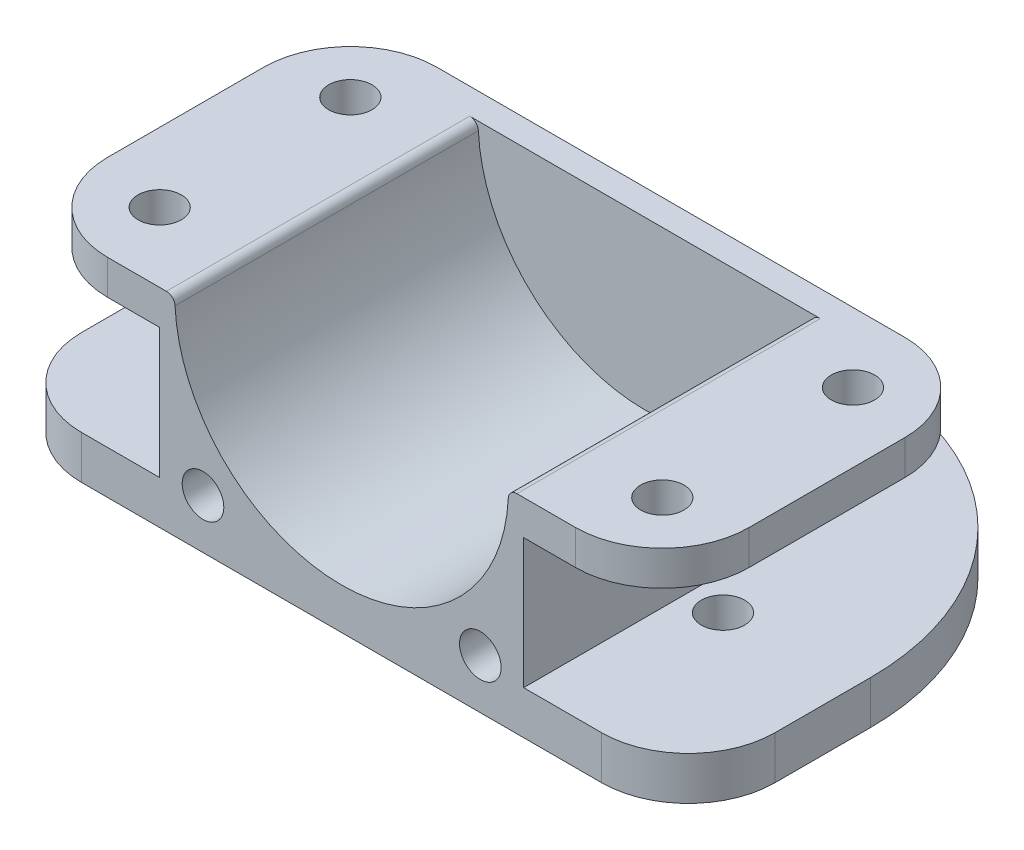
ISO-10303-21;
HEADER;
FILE_DESCRIPTION(('STEP AP214'),'2;1');
FILE_NAME('part.step','',(''),(''),'','','');
FILE_SCHEMA(('AUTOMOTIVE_DESIGN { 1 0 10303 214 1 1 1 1 }'));
ENDSEC;
DATA;
#1=APPLICATION_CONTEXT('core data for automotive mechanical design processes');
#2=APPLICATION_PROTOCOL_DEFINITION('international standard','automotive_design',2000,#1);
#3=PRODUCT_CONTEXT('',#1,'mechanical');
#4=PRODUCT('Part','Part','',(#3));
#5=PRODUCT_RELATED_PRODUCT_CATEGORY('part','',(#4));
#6=PRODUCT_DEFINITION_FORMATION('','',#4);
#7=PRODUCT_DEFINITION_CONTEXT('part definition',#1,'design');
#8=PRODUCT_DEFINITION('design','',#6,#7);
#9=PRODUCT_DEFINITION_SHAPE('','',#8);
#10=(LENGTH_UNIT() NAMED_UNIT(*) SI_UNIT(.MILLI.,.METRE.));
#11=(NAMED_UNIT(*) PLANE_ANGLE_UNIT() SI_UNIT($,.RADIAN.));
#12=(NAMED_UNIT(*) SI_UNIT($,.STERADIAN.) SOLID_ANGLE_UNIT());
#13=UNCERTAINTY_MEASURE_WITH_UNIT(LENGTH_MEASURE(1.E-05),#10,'distance_accuracy_value','');
#14=(GEOMETRIC_REPRESENTATION_CONTEXT(3) GLOBAL_UNCERTAINTY_ASSIGNED_CONTEXT((#13)) GLOBAL_UNIT_ASSIGNED_CONTEXT((#10,
#11,#12)) REPRESENTATION_CONTEXT('',''));
#15=CARTESIAN_POINT('',(0.,0.,0.));
#16=DIRECTION('',(0.,0.,1.));
#17=DIRECTION('',(1.,0.,0.));
#18=AXIS2_PLACEMENT_3D('',#15,#16,#17);
#19=CARTESIAN_POINT('',(-21.,-24.,-35.));
#20=DIRECTION('',(-1.,0.,0.));
#21=DIRECTION('',(0.,0.,1.));
#22=AXIS2_PLACEMENT_3D('',#19,#20,#21);
#23=PLANE('',#22);
#24=DIRECTION('',(0.,-1.,0.));
#25=VECTOR('',#24,1.);
#26=CARTESIAN_POINT('',(-21.,-24.,0.));
#27=LINE('',#26,#25);
#28=CARTESIAN_POINT('',(-21.,-4.,0.));
#29=VERTEX_POINT('',#28);
#30=CARTESIAN_POINT('',(-21.,-19.,0.));
#31=VERTEX_POINT('',#30);
#32=EDGE_CURVE('E228',#29,#31,#27,.T.);
#33=ORIENTED_EDGE('',*,*,#32,.F.);
#34=DIRECTION('',(0.,0.,1.));
#35=VECTOR('',#34,1.);
#36=CARTESIAN_POINT('',(-21.,-4.,0.));
#37=LINE('',#36,#35);
#38=CARTESIAN_POINT('',(-21.,-4.00000000000001,-38.));
#39=VERTEX_POINT('',#38);
#40=EDGE_CURVE('E214',#39,#29,#37,.T.);
#41=ORIENTED_EDGE('',*,*,#40,.F.);
#42=DIRECTION('',(0.,1.,0.));
#43=VECTOR('',#42,1.);
#44=CARTESIAN_POINT('',(-21.,-19.,-38.));
#45=LINE('',#44,#43);
#46=CARTESIAN_POINT('',(-21.,-19.,-38.));
#47=VERTEX_POINT('',#46);
#48=EDGE_CURVE('E226',#47,#39,#45,.T.);
#49=ORIENTED_EDGE('',*,*,#48,.F.);
#50=DIRECTION('',(0.,0.,1.));
#51=VECTOR('',#50,1.);
#52=CARTESIAN_POINT('',(-21.,-19.,-54.6468827043885));
#53=LINE('',#52,#51);
#54=EDGE_CURVE('E286',#47,#31,#53,.T.);
#55=ORIENTED_EDGE('',*,*,#54,.T.);
#56=EDGE_LOOP('',(#33,#41,#49,#55));
#57=FACE_BOUND('',#56,.T.);
#58=ADVANCED_FACE('F45',(#57),#23,.T.);
#59=CARTESIAN_POINT('',(0.,0.,-38.));
#60=DIRECTION('',(0.,0.,-1.));
#61=DIRECTION('',(-1.,0.,0.));
#62=AXIS2_PLACEMENT_3D('',#59,#60,#61);
#63=PLANE('',#62);
#64=DIRECTION('',(1.,0.,0.));
#65=VECTOR('',#64,1.);
#66=CARTESIAN_POINT('',(-21.,0.,-38.));
#67=LINE('',#66,#65);
#68=CARTESIAN_POINT('',(-27.,0.,-38.));
#69=VERTEX_POINT('',#68);
#70=CARTESIAN_POINT('',(27.,0.,-38.));
#71=VERTEX_POINT('',#70);
#72=EDGE_CURVE('E452',#69,#71,#67,.T.);
#73=ORIENTED_EDGE('',*,*,#72,.T.);
#74=DIRECTION('',(0.,-1.,0.));
#75=VECTOR('',#74,1.);
#76=CARTESIAN_POINT('',(27.,-4.00000000000001,-38.));
#77=LINE('',#76,#75);
#78=CARTESIAN_POINT('',(27.,-4.00000000000001,-38.));
#79=VERTEX_POINT('',#78);
#80=EDGE_CURVE('E431',#71,#79,#77,.T.);
#81=ORIENTED_EDGE('',*,*,#80,.T.);
#82=DIRECTION('',(-1.,0.,0.));
#83=VECTOR('',#82,1.);
#84=CARTESIAN_POINT('',(37.,-4.00000000000001,-38.));
#85=LINE('',#84,#83);
#86=CARTESIAN_POINT('',(21.,-4.,-38.));
#87=VERTEX_POINT('',#86);
#88=EDGE_CURVE('E468',#79,#87,#85,.T.);
#89=ORIENTED_EDGE('',*,*,#88,.T.);
#90=DIRECTION('',(0.,-1.,0.));
#91=VECTOR('',#90,1.);
#92=CARTESIAN_POINT('',(21.,24.,-38.));
#93=LINE('',#92,#91);
#94=CARTESIAN_POINT('',(21.,-19.,-38.));
#95=VERTEX_POINT('',#94);
#96=EDGE_CURVE('E240',#87,#95,#93,.T.);
#97=ORIENTED_EDGE('',*,*,#96,.T.);
#98=DIRECTION('',(-1.,0.,0.));
#99=VECTOR('',#98,1.);
#100=CARTESIAN_POINT('',(-40.,-19.,-38.));
#101=LINE('',#100,#99);
#102=EDGE_CURVE('E237',#95,#47,#101,.T.);
#103=ORIENTED_EDGE('',*,*,#102,.T.);
#104=ORIENTED_EDGE('',*,*,#48,.T.);
#105=DIRECTION('',(1.,0.,0.));
#106=VECTOR('',#105,1.);
#107=CARTESIAN_POINT('',(-37.,-4.00000000000001,-38.));
#108=LINE('',#107,#106);
#109=CARTESIAN_POINT('',(-27.,-4.00000000000001,-38.));
#110=VERTEX_POINT('',#109);
#111=EDGE_CURVE('E209',#110,#39,#108,.T.);
#112=ORIENTED_EDGE('',*,*,#111,.F.);
#113=DIRECTION('',(0.,-1.,0.));
#114=VECTOR('',#113,1.);
#115=CARTESIAN_POINT('',(-27.,0.,-38.));
#116=LINE('',#115,#114);
#117=EDGE_CURVE('E419',#110,#69,#116,.F.);
#118=ORIENTED_EDGE('',*,*,#117,.T.);
#119=EDGE_LOOP('',(#73,#81,#89,#97,#103,#104,#112,#118));
#120=FACE_BOUND('',#119,.T.);
#121=ADVANCED_FACE('F235',(#120),#63,.T.);
#122=CARTESIAN_POINT('',(21.,-24.,-35.));
#123=DIRECTION('',(1.,0.,0.));
#124=DIRECTION('',(0.,0.,-1.));
#125=AXIS2_PLACEMENT_3D('',#122,#123,#124);
#126=PLANE('',#125);
#127=DIRECTION('',(0.,0.,1.));
#128=VECTOR('',#127,1.);
#129=CARTESIAN_POINT('',(21.,-4.,0.));
#130=LINE('',#129,#128);
#131=CARTESIAN_POINT('',(21.,-4.00000000000001,0.));
#132=VERTEX_POINT('',#131);
#133=EDGE_CURVE('E471',#87,#132,#130,.T.);
#134=ORIENTED_EDGE('',*,*,#133,.T.);
#135=DIRECTION('',(0.,1.,0.));
#136=VECTOR('',#135,1.);
#137=CARTESIAN_POINT('',(21.,-24.,0.));
#138=LINE('',#137,#136);
#139=CARTESIAN_POINT('',(21.,-19.,0.));
#140=VERTEX_POINT('',#139);
#141=EDGE_CURVE('E313',#140,#132,#138,.T.);
#142=ORIENTED_EDGE('',*,*,#141,.F.);
#143=DIRECTION('',(0.,0.,1.));
#144=VECTOR('',#143,1.);
#145=CARTESIAN_POINT('',(21.,-19.,-54.6468827043885));
#146=LINE('',#145,#144);
#147=EDGE_CURVE('E255',#95,#140,#146,.T.);
#148=ORIENTED_EDGE('',*,*,#147,.F.);
#149=ORIENTED_EDGE('',*,*,#96,.F.);
#150=EDGE_LOOP('',(#134,#142,#148,#149));
#151=FACE_BOUND('',#150,.T.);
#152=ADVANCED_FACE('F591',(#151),#126,.T.);
#153=CARTESIAN_POINT('',(-21.,-24.,-35.));
#154=DIRECTION('',(0.,-1.,0.));
#155=DIRECTION('',(0.,0.,-1.));
#156=AXIS2_PLACEMENT_3D('',#153,#154,#155);
#157=PLANE('',#156);
#158=CARTESIAN_POINT('',(-15.,-24.,-43.));
#159=DIRECTION('',(0.,-1.,0.));
#160=DIRECTION('',(0.,0.,-1.));
#161=AXIS2_PLACEMENT_3D('',#158,#159,#160);
#162=CIRCLE('',#161,2.5);
#163=CARTESIAN_POINT('',(-15.,-24.,-45.5));
#164=VERTEX_POINT('',#163);
#165=EDGE_CURVE('E517',#164,#164,#162,.F.);
#166=ORIENTED_EDGE('',*,*,#165,.T.);
#167=EDGE_LOOP('',(#166));
#168=FACE_BOUND('',#167,.T.);
#169=CARTESIAN_POINT('',(15.,-24.,-43.));
#170=DIRECTION('',(0.,-1.,0.));
#171=DIRECTION('',(0.,0.,-1.));
#172=AXIS2_PLACEMENT_3D('',#169,#170,#171);
#173=CIRCLE('',#172,2.5);
#174=CARTESIAN_POINT('',(15.,-24.,-45.5));
#175=VERTEX_POINT('',#174);
#176=EDGE_CURVE('E521',#175,#175,#173,.F.);
#177=ORIENTED_EDGE('',*,*,#176,.T.);
#178=EDGE_LOOP('',(#177));
#179=FACE_BOUND('',#178,.T.);
#180=CARTESIAN_POINT('',(-25.,-24.,-19.));
#181=DIRECTION('',(0.,-1.,0.));
#182=DIRECTION('',(0.,0.,-1.));
#183=AXIS2_PLACEMENT_3D('',#180,#181,#182);
#184=CIRCLE('',#183,2.5);
#185=CARTESIAN_POINT('',(-25.,-24.,-21.5));
#186=VERTEX_POINT('',#185);
#187=EDGE_CURVE('E256',#186,#186,#184,.F.);
#188=ORIENTED_EDGE('',*,*,#187,.T.);
#189=EDGE_LOOP('',(#188));
#190=FACE_BOUND('',#189,.T.);
#191=CARTESIAN_POINT('',(25.,-24.,-19.));
#192=DIRECTION('',(0.,-1.,0.));
#193=DIRECTION('',(0.,0.,-1.));
#194=AXIS2_PLACEMENT_3D('',#191,#192,#193);
#195=CIRCLE('',#194,2.5);
#196=CARTESIAN_POINT('',(25.,-24.,-21.5));
#197=VERTEX_POINT('',#196);
#198=EDGE_CURVE('E245',#197,#197,#195,.F.);
#199=ORIENTED_EDGE('',*,*,#198,.T.);
#200=EDGE_LOOP('',(#199));
#201=FACE_BOUND('',#200,.T.);
#202=DIRECTION('',(1.,0.,0.));
#203=VECTOR('',#202,1.);
#204=CARTESIAN_POINT('',(-21.,-24.,0.));
#205=LINE('',#204,#203);
#206=CARTESIAN_POINT('',(-30.,-24.,0.));
#207=VERTEX_POINT('',#206);
#208=CARTESIAN_POINT('',(30.,-24.,0.));
#209=VERTEX_POINT('',#208);
#210=EDGE_CURVE('E322',#207,#209,#205,.T.);
#211=ORIENTED_EDGE('',*,*,#210,.F.);
#212=CARTESIAN_POINT('',(-30.,-24.,-10.));
#213=DIRECTION('',(0.,-1.,0.));
#214=DIRECTION('',(0.,0.,-1.));
#215=AXIS2_PLACEMENT_3D('',#212,#213,#214);
#216=CIRCLE('',#215,10.);
#217=CARTESIAN_POINT('',(-40.,-24.,-10.));
#218=VERTEX_POINT('',#217);
#219=EDGE_CURVE('E391',#207,#218,#216,.T.);
#220=ORIENTED_EDGE('',*,*,#219,.T.);
#221=DIRECTION('',(0.,0.,1.));
#222=VECTOR('',#221,1.);
#223=CARTESIAN_POINT('',(-40.,-24.,-54.6468827043885));
#224=LINE('',#223,#222);
#225=CARTESIAN_POINT('',(-40.,-24.,-21.));
#226=VERTEX_POINT('',#225);
#227=EDGE_CURVE('E282',#226,#218,#224,.T.);
#228=ORIENTED_EDGE('',*,*,#227,.F.);
#229=CARTESIAN_POINT('',(-10.,-24.,-21.));
#230=DIRECTION('',(0.,-1.,0.));
#231=DIRECTION('',(0.,0.,-1.));
#232=AXIS2_PLACEMENT_3D('',#229,#230,#231);
#233=CIRCLE('',#232,30.);
#234=CARTESIAN_POINT('',(-10.,-24.,-51.));
#235=VERTEX_POINT('',#234);
#236=EDGE_CURVE('E361',#226,#235,#233,.T.);
#237=ORIENTED_EDGE('',*,*,#236,.T.);
#238=DIRECTION('',(1.,0.,0.));
#239=VECTOR('',#238,1.);
#240=CARTESIAN_POINT('',(-40.,-24.,-51.));
#241=LINE('',#240,#239);
#242=CARTESIAN_POINT('',(9.99999999999999,-24.,-51.));
#243=VERTEX_POINT('',#242);
#244=EDGE_CURVE('E516',#235,#243,#241,.T.);
#245=ORIENTED_EDGE('',*,*,#244,.T.);
#246=CARTESIAN_POINT('',(9.99999999999999,-24.,-21.));
#247=DIRECTION('',(0.,-1.,0.));
#248=DIRECTION('',(0.,0.,-1.));
#249=AXIS2_PLACEMENT_3D('',#246,#247,#248);
#250=CIRCLE('',#249,30.);
#251=CARTESIAN_POINT('',(40.,-24.,-21.));
#252=VERTEX_POINT('',#251);
#253=EDGE_CURVE('E358',#243,#252,#250,.T.);
#254=ORIENTED_EDGE('',*,*,#253,.T.);
#255=DIRECTION('',(0.,0.,1.));
#256=VECTOR('',#255,1.);
#257=CARTESIAN_POINT('',(40.,-24.,-54.6468827043885));
#258=LINE('',#257,#256);
#259=CARTESIAN_POINT('',(40.,-24.,-10.));
#260=VERTEX_POINT('',#259);
#261=EDGE_CURVE('E263',#252,#260,#258,.T.);
#262=ORIENTED_EDGE('',*,*,#261,.T.);
#263=CARTESIAN_POINT('',(30.,-24.,-10.));
#264=DIRECTION('',(0.,-1.,0.));
#265=DIRECTION('',(0.,0.,-1.));
#266=AXIS2_PLACEMENT_3D('',#263,#264,#265);
#267=CIRCLE('',#266,10.);
#268=EDGE_CURVE('E388',#260,#209,#267,.T.);
#269=ORIENTED_EDGE('',*,*,#268,.T.);
#270=EDGE_LOOP('',(#211,#220,#228,#237,#245,#254,#262,#269));
#271=FACE_BOUND('',#270,.T.);
#272=ADVANCED_FACE('F595',(#168,#179,#190,#201,#271),#157,.T.);
#273=CARTESIAN_POINT('',(0.,0.,0.));
#274=DIRECTION('',(0.,0.,-1.));
#275=DIRECTION('',(-1.,0.,0.));
#276=AXIS2_PLACEMENT_3D('',#273,#274,#275);
#277=PLANE('',#276);
#278=CARTESIAN_POINT('',(-16.,-18.2857142857143,0.));
#279=DIRECTION('',(0.,0.,1.));
#280=DIRECTION('',(1.,0.,0.));
#281=AXIS2_PLACEMENT_3D('',#278,#279,#280);
#282=CIRCLE('',#281,2.4);
#283=CARTESIAN_POINT('',(-13.6,-18.2857142857143,0.));
#284=VERTEX_POINT('',#283);
#285=EDGE_CURVE('E292',#284,#284,#282,.T.);
#286=ORIENTED_EDGE('',*,*,#285,.F.);
#287=EDGE_LOOP('',(#286));
#288=FACE_BOUND('',#287,.T.);
#289=CARTESIAN_POINT('',(16.,-18.2857142857143,0.));
#290=DIRECTION('',(0.,0.,1.));
#291=DIRECTION('',(1.,0.,0.));
#292=AXIS2_PLACEMENT_3D('',#289,#290,#291);
#293=CIRCLE('',#292,2.4);
#294=CARTESIAN_POINT('',(18.4,-18.2857142857143,0.));
#295=VERTEX_POINT('',#294);
#296=EDGE_CURVE('E297',#295,#295,#293,.T.);
#297=ORIENTED_EDGE('',*,*,#296,.F.);
#298=EDGE_LOOP('',(#297));
#299=FACE_BOUND('',#298,.T.);
#300=DIRECTION('',(-1.,0.,0.));
#301=VECTOR('',#300,1.);
#302=CARTESIAN_POINT('',(37.,-4.,0.));
#303=LINE('',#302,#301);
#304=CARTESIAN_POINT('',(27.,-4.,0.));
#305=VERTEX_POINT('',#304);
#306=EDGE_CURVE('E485',#305,#132,#303,.T.);
#307=ORIENTED_EDGE('',*,*,#306,.F.);
#308=DIRECTION('',(0.,1.,0.));
#309=VECTOR('',#308,1.);
#310=CARTESIAN_POINT('',(27.,0.,0.));
#311=LINE('',#310,#309);
#312=CARTESIAN_POINT('',(27.,0.,0.));
#313=VERTEX_POINT('',#312);
#314=EDGE_CURVE('E11',#305,#313,#311,.T.);
#315=ORIENTED_EDGE('',*,*,#314,.T.);
#316=DIRECTION('',(1.,0.,0.));
#317=VECTOR('',#316,1.);
#318=CARTESIAN_POINT('',(-21.,0.,0.));
#319=LINE('',#318,#317);
#320=CARTESIAN_POINT('',(20.2252935701809,0.,0.));
#321=VERTEX_POINT('',#320);
#322=EDGE_CURVE('E537',#321,#313,#319,.T.);
#323=ORIENTED_EDGE('',*,*,#322,.F.);
#324=CARTESIAN_POINT('',(20.2252935701809,-1.,0.));
#325=DIRECTION('',(0.,0.,-1.));
#326=DIRECTION('',(-1.,0.,0.));
#327=AXIS2_PLACEMENT_3D('',#324,#325,#326);
#328=CIRCLE('',#327,1.);
#329=CARTESIAN_POINT('',(19.2265136407892,-0.950617283950617,0.));
#330=VERTEX_POINT('',#329);
#331=EDGE_CURVE('E338',#321,#330,#328,.F.);
#332=ORIENTED_EDGE('',*,*,#331,.T.);
#333=CARTESIAN_POINT('',(0.,0.,0.));
#334=DIRECTION('',(0.,0.,1.));
#335=DIRECTION('',(1.,0.,0.));
#336=AXIS2_PLACEMENT_3D('',#333,#334,#335);
#337=CIRCLE('',#336,19.25);
#338=CARTESIAN_POINT('',(-19.2265136407892,-0.950617283950617,0.));
#339=VERTEX_POINT('',#338);
#340=EDGE_CURVE('E305',#339,#330,#337,.T.);
#341=ORIENTED_EDGE('',*,*,#340,.F.);
#342=CARTESIAN_POINT('',(-20.2252935701809,-1.,0.));
#343=DIRECTION('',(0.,0.,-1.));
#344=DIRECTION('',(-1.,0.,0.));
#345=AXIS2_PLACEMENT_3D('',#342,#343,#344);
#346=CIRCLE('',#345,1.);
#347=CARTESIAN_POINT('',(-20.2252935701809,0.,0.));
#348=VERTEX_POINT('',#347);
#349=EDGE_CURVE('E334',#339,#348,#346,.F.);
#350=ORIENTED_EDGE('',*,*,#349,.T.);
#351=CARTESIAN_POINT('',(-27.,0.,0.));
#352=VERTEX_POINT('',#351);
#353=EDGE_CURVE('E459',#352,#348,#319,.T.);
#354=ORIENTED_EDGE('',*,*,#353,.F.);
#355=DIRECTION('',(0.,1.,0.));
#356=VECTOR('',#355,1.);
#357=CARTESIAN_POINT('',(-27.,0.,0.));
#358=LINE('',#357,#356);
#359=CARTESIAN_POINT('',(-27.,-4.,0.));
#360=VERTEX_POINT('',#359);
#361=EDGE_CURVE('E428',#352,#360,#358,.F.);
#362=ORIENTED_EDGE('',*,*,#361,.T.);
#363=DIRECTION('',(1.,0.,0.));
#364=VECTOR('',#363,1.);
#365=CARTESIAN_POINT('',(-37.,-4.,0.));
#366=LINE('',#365,#364);
#367=EDGE_CURVE('E222',#360,#29,#366,.T.);
#368=ORIENTED_EDGE('',*,*,#367,.T.);
#369=ORIENTED_EDGE('',*,*,#32,.T.);
#370=DIRECTION('',(-1.,0.,0.));
#371=VECTOR('',#370,1.);
#372=CARTESIAN_POINT('',(-21.,-19.,0.));
#373=LINE('',#372,#371);
#374=CARTESIAN_POINT('',(-30.,-19.,0.));
#375=VERTEX_POINT('',#374);
#376=EDGE_CURVE('E277',#31,#375,#373,.T.);
#377=ORIENTED_EDGE('',*,*,#376,.T.);
#378=DIRECTION('',(0.,-1.,0.));
#379=VECTOR('',#378,1.);
#380=CARTESIAN_POINT('',(-30.,-24.,0.));
#381=LINE('',#380,#379);
#382=EDGE_CURVE('E384',#375,#207,#381,.T.);
#383=ORIENTED_EDGE('',*,*,#382,.T.);
#384=ORIENTED_EDGE('',*,*,#210,.T.);
#385=DIRECTION('',(0.,1.,0.));
#386=VECTOR('',#385,1.);
#387=CARTESIAN_POINT('',(30.,-19.,0.));
#388=LINE('',#387,#386);
#389=CARTESIAN_POINT('',(30.,-19.,0.));
#390=VERTEX_POINT('',#389);
#391=EDGE_CURVE('E380',#209,#390,#388,.T.);
#392=ORIENTED_EDGE('',*,*,#391,.T.);
#393=DIRECTION('',(-1.,0.,0.));
#394=VECTOR('',#393,1.);
#395=CARTESIAN_POINT('',(21.,-19.,0.));
#396=LINE('',#395,#394);
#397=EDGE_CURVE('E267',#390,#140,#396,.T.);
#398=ORIENTED_EDGE('',*,*,#397,.T.);
#399=ORIENTED_EDGE('',*,*,#141,.T.);
#400=EDGE_LOOP('',(#307,#315,#323,#332,#341,#350,#354,#362,#368,#369,#377,#383,#384,#392,#398,#399));
#401=FACE_BOUND('',#400,.T.);
#402=ADVANCED_FACE('F555',(#288,#299,#401),#277,.F.);
#403=CARTESIAN_POINT('',(0.,0.,-35.));
#404=DIRECTION('',(0.,0.,1.));
#405=DIRECTION('',(1.,0.,0.));
#406=AXIS2_PLACEMENT_3D('',#403,#404,#405);
#407=CYLINDRICAL_SURFACE('',#406,19.25);
#408=ORIENTED_EDGE('',*,*,#340,.T.);
#409=DIRECTION('',(0.,0.,1.));
#410=VECTOR('',#409,1.);
#411=CARTESIAN_POINT('',(19.2265136407892,-0.950617283950617,-35.));
#412=LINE('',#411,#410);
#413=CARTESIAN_POINT('',(19.2265136407892,-0.950617283950617,-35.));
#414=VERTEX_POINT('',#413);
#415=EDGE_CURVE('E344',#330,#414,#412,.F.);
#416=ORIENTED_EDGE('',*,*,#415,.T.);
#417=CARTESIAN_POINT('',(0.,0.,-35.));
#418=DIRECTION('',(0.,0.,1.));
#419=DIRECTION('',(1.,0.,0.));
#420=AXIS2_PLACEMENT_3D('',#417,#418,#419);
#421=CIRCLE('',#420,19.25);
#422=CARTESIAN_POINT('',(-19.2265136407892,-0.950617283950617,-35.));
#423=VERTEX_POINT('',#422);
#424=EDGE_CURVE('E309',#423,#414,#421,.T.);
#425=ORIENTED_EDGE('',*,*,#424,.F.);
#426=DIRECTION('',(0.,0.,1.));
#427=VECTOR('',#426,1.);
#428=CARTESIAN_POINT('',(-19.2265136407892,-0.950617283950617,-35.));
#429=LINE('',#428,#427);
#430=EDGE_CURVE('E341',#423,#339,#429,.T.);
#431=ORIENTED_EDGE('',*,*,#430,.T.);
#432=EDGE_LOOP('',(#408,#416,#425,#431));
#433=FACE_BOUND('',#432,.T.);
#434=ADVANCED_FACE('F558',(#433),#407,.F.);
#435=CARTESIAN_POINT('',(16.,-18.2857142857143,-35.));
#436=DIRECTION('',(0.,0.,1.));
#437=DIRECTION('',(1.,0.,0.));
#438=AXIS2_PLACEMENT_3D('',#435,#436,#437);
#439=CYLINDRICAL_SURFACE('',#438,2.4);
#440=CARTESIAN_POINT('',(16.,-18.2857142857143,-35.));
#441=DIRECTION('',(0.,0.,1.));
#442=DIRECTION('',(1.,0.,0.));
#443=AXIS2_PLACEMENT_3D('',#440,#441,#442);
#444=CIRCLE('',#443,2.4);
#445=CARTESIAN_POINT('',(18.4,-18.2857142857143,-35.));
#446=VERTEX_POINT('',#445);
#447=EDGE_CURVE('E301',#446,#446,#444,.T.);
#448=ORIENTED_EDGE('',*,*,#447,.F.);
#449=EDGE_LOOP('',(#448));
#450=FACE_BOUND('',#449,.T.);
#451=ORIENTED_EDGE('',*,*,#296,.T.);
#452=EDGE_LOOP('',(#451));
#453=FACE_BOUND('',#452,.T.);
#454=ADVANCED_FACE('F722',(#450,#453),#439,.F.);
#455=CARTESIAN_POINT('',(-16.,-18.2857142857143,-35.));
#456=DIRECTION('',(0.,0.,1.));
#457=DIRECTION('',(1.,0.,0.));
#458=AXIS2_PLACEMENT_3D('',#455,#456,#457);
#459=CYLINDRICAL_SURFACE('',#458,2.4);
#460=CARTESIAN_POINT('',(-16.,-18.2857142857143,-35.));
#461=DIRECTION('',(0.,0.,1.));
#462=DIRECTION('',(1.,0.,0.));
#463=AXIS2_PLACEMENT_3D('',#460,#461,#462);
#464=CIRCLE('',#463,2.4);
#465=CARTESIAN_POINT('',(-13.6,-18.2857142857143,-35.));
#466=VERTEX_POINT('',#465);
#467=EDGE_CURVE('E293',#466,#466,#464,.T.);
#468=ORIENTED_EDGE('',*,*,#467,.F.);
#469=EDGE_LOOP('',(#468));
#470=FACE_BOUND('',#469,.T.);
#471=ORIENTED_EDGE('',*,*,#285,.T.);
#472=EDGE_LOOP('',(#471));
#473=FACE_BOUND('',#472,.T.);
#474=ADVANCED_FACE('F718',(#470,#473),#459,.F.);
#475=CARTESIAN_POINT('',(-21.,-19.,-54.6468827043885));
#476=DIRECTION('',(0.,1.,0.));
#477=DIRECTION('',(-1.,0.,0.));
#478=AXIS2_PLACEMENT_3D('',#475,#476,#477);
#479=PLANE('',#478);
#480=CARTESIAN_POINT('',(-15.,-19.,-43.));
#481=DIRECTION('',(0.,1.,0.));
#482=DIRECTION('',(-1.,0.,0.));
#483=AXIS2_PLACEMENT_3D('',#480,#481,#482);
#484=CIRCLE('',#483,2.5);
#485=CARTESIAN_POINT('',(-17.5,-19.,-43.));
#486=VERTEX_POINT('',#485);
#487=EDGE_CURVE('E512',#486,#486,#484,.T.);
#488=ORIENTED_EDGE('',*,*,#487,.F.);
#489=EDGE_LOOP('',(#488));
#490=FACE_BOUND('',#489,.T.);
#491=CARTESIAN_POINT('',(15.,-19.,-43.));
#492=DIRECTION('',(0.,1.,0.));
#493=DIRECTION('',(-1.,0.,0.));
#494=AXIS2_PLACEMENT_3D('',#491,#492,#493);
#495=CIRCLE('',#494,2.5);
#496=CARTESIAN_POINT('',(12.5,-19.,-43.));
#497=VERTEX_POINT('',#496);
#498=EDGE_CURVE('E221',#497,#497,#495,.T.);
#499=ORIENTED_EDGE('',*,*,#498,.F.);
#500=EDGE_LOOP('',(#499));
#501=FACE_BOUND('',#500,.T.);
#502=CARTESIAN_POINT('',(-25.,-19.,-19.));
#503=DIRECTION('',(0.,1.,0.));
#504=DIRECTION('',(0.,0.,1.));
#505=AXIS2_PLACEMENT_3D('',#502,#503,#504);
#506=CIRCLE('',#505,2.5);
#507=CARTESIAN_POINT('',(-25.,-19.,-16.5));
#508=VERTEX_POINT('',#507);
#509=EDGE_CURVE('E251',#508,#508,#506,.T.);
#510=ORIENTED_EDGE('',*,*,#509,.F.);
#511=EDGE_LOOP('',(#510));
#512=FACE_BOUND('',#511,.T.);
#513=DIRECTION('',(0.,0.,1.));
#514=VECTOR('',#513,1.);
#515=CARTESIAN_POINT('',(-40.,-19.,-54.6468827043885));
#516=LINE('',#515,#514);
#517=CARTESIAN_POINT('',(-40.,-19.,-21.));
#518=VERTEX_POINT('',#517);
#519=CARTESIAN_POINT('',(-40.,-19.,-10.));
#520=VERTEX_POINT('',#519);
#521=EDGE_CURVE('E281',#518,#520,#516,.T.);
#522=ORIENTED_EDGE('',*,*,#521,.T.);
#523=CARTESIAN_POINT('',(-30.,-19.,-10.));
#524=DIRECTION('',(0.,1.,0.));
#525=DIRECTION('',(-1.,0.,0.));
#526=AXIS2_PLACEMENT_3D('',#523,#524,#525);
#527=CIRCLE('',#526,10.);
#528=EDGE_CURVE('E400',#520,#375,#527,.T.);
#529=ORIENTED_EDGE('',*,*,#528,.T.);
#530=ORIENTED_EDGE('',*,*,#376,.F.);
#531=ORIENTED_EDGE('',*,*,#54,.F.);
#532=ORIENTED_EDGE('',*,*,#102,.F.);
#533=ORIENTED_EDGE('',*,*,#147,.T.);
#534=ORIENTED_EDGE('',*,*,#397,.F.);
#535=CARTESIAN_POINT('',(30.,-19.,-10.));
#536=DIRECTION('',(0.,1.,0.));
#537=DIRECTION('',(-1.,0.,0.));
#538=AXIS2_PLACEMENT_3D('',#535,#536,#537);
#539=CIRCLE('',#538,10.);
#540=CARTESIAN_POINT('',(40.,-19.,-10.));
#541=VERTEX_POINT('',#540);
#542=EDGE_CURVE('E397',#390,#541,#539,.T.);
#543=ORIENTED_EDGE('',*,*,#542,.T.);
#544=DIRECTION('',(0.,0.,1.));
#545=VECTOR('',#544,1.);
#546=CARTESIAN_POINT('',(40.,-19.,-54.6468827043885));
#547=LINE('',#546,#545);
#548=CARTESIAN_POINT('',(40.,-19.,-21.));
#549=VERTEX_POINT('',#548);
#550=EDGE_CURVE('E268',#549,#541,#547,.T.);
#551=ORIENTED_EDGE('',*,*,#550,.F.);
#552=CARTESIAN_POINT('',(9.99999999999999,-19.,-21.));
#553=DIRECTION('',(0.,1.,0.));
#554=DIRECTION('',(-1.,0.,0.));
#555=AXIS2_PLACEMENT_3D('',#552,#553,#554);
#556=CIRCLE('',#555,30.);
#557=CARTESIAN_POINT('',(9.99999999999999,-19.,-51.));
#558=VERTEX_POINT('',#557);
#559=EDGE_CURVE('E371',#549,#558,#556,.T.);
#560=ORIENTED_EDGE('',*,*,#559,.T.);
#561=DIRECTION('',(1.,0.,0.));
#562=VECTOR('',#561,1.);
#563=CARTESIAN_POINT('',(-40.,-19.,-51.));
#564=LINE('',#563,#562);
#565=CARTESIAN_POINT('',(-10.,-19.,-51.));
#566=VERTEX_POINT('',#565);
#567=EDGE_CURVE('E531',#566,#558,#564,.T.);
#568=ORIENTED_EDGE('',*,*,#567,.F.);
#569=CARTESIAN_POINT('',(-10.,-19.,-21.));
#570=DIRECTION('',(0.,1.,0.));
#571=DIRECTION('',(-1.,0.,0.));
#572=AXIS2_PLACEMENT_3D('',#569,#570,#571);
#573=CIRCLE('',#572,30.);
#574=EDGE_CURVE('E374',#566,#518,#573,.T.);
#575=ORIENTED_EDGE('',*,*,#574,.T.);
#576=EDGE_LOOP('',(#522,#529,#530,#531,#532,#533,#534,#543,#551,#560,#568,#575));
#577=FACE_BOUND('',#576,.T.);
#578=CARTESIAN_POINT('',(25.,-19.,-19.));
#579=DIRECTION('',(0.,1.,0.));
#580=DIRECTION('',(0.,0.,1.));
#581=AXIS2_PLACEMENT_3D('',#578,#579,#580);
#582=CIRCLE('',#581,2.5);
#583=CARTESIAN_POINT('',(25.,-19.,-16.5));
#584=VERTEX_POINT('',#583);
#585=EDGE_CURVE('E239',#584,#584,#582,.T.);
#586=ORIENTED_EDGE('',*,*,#585,.F.);
#587=EDGE_LOOP('',(#586));
#588=FACE_BOUND('',#587,.T.);
#589=ADVANCED_FACE('F653',(#490,#501,#512,#577,#588),#479,.T.);
#590=CARTESIAN_POINT('',(-40.,-24.,-54.6468827043885));
#591=DIRECTION('',(-1.,0.,0.));
#592=DIRECTION('',(0.,0.,1.));
#593=AXIS2_PLACEMENT_3D('',#590,#591,#592);
#594=PLANE('',#593);
#595=ORIENTED_EDGE('',*,*,#227,.T.);
#596=DIRECTION('',(0.,-1.,0.));
#597=VECTOR('',#596,1.);
#598=CARTESIAN_POINT('',(-40.,-19.,-10.));
#599=LINE('',#598,#597);
#600=EDGE_CURVE('E394',#218,#520,#599,.F.);
#601=ORIENTED_EDGE('',*,*,#600,.T.);
#602=ORIENTED_EDGE('',*,*,#521,.F.);
#603=DIRECTION('',(0.,-1.,0.));
#604=VECTOR('',#603,1.);
#605=CARTESIAN_POINT('',(-40.,-24.,-21.));
#606=LINE('',#605,#604);
#607=EDGE_CURVE('E354',#518,#226,#606,.T.);
#608=ORIENTED_EDGE('',*,*,#607,.T.);
#609=EDGE_LOOP('',(#595,#601,#602,#608));
#610=FACE_BOUND('',#609,.T.);
#611=ADVANCED_FACE('F638',(#610),#594,.T.);
#612=CARTESIAN_POINT('',(40.,-24.,-54.6468827043885));
#613=DIRECTION('',(1.,0.,0.));
#614=DIRECTION('',(0.,0.,-1.));
#615=AXIS2_PLACEMENT_3D('',#612,#613,#614);
#616=PLANE('',#615);
#617=ORIENTED_EDGE('',*,*,#550,.T.);
#618=DIRECTION('',(0.,1.,0.));
#619=VECTOR('',#618,1.);
#620=CARTESIAN_POINT('',(40.,-24.,-10.));
#621=LINE('',#620,#619);
#622=EDGE_CURVE('E403',#541,#260,#621,.F.);
#623=ORIENTED_EDGE('',*,*,#622,.T.);
#624=ORIENTED_EDGE('',*,*,#261,.F.);
#625=DIRECTION('',(0.,-1.,0.));
#626=VECTOR('',#625,1.);
#627=CARTESIAN_POINT('',(40.,-24.,-21.));
#628=LINE('',#627,#626);
#629=EDGE_CURVE('E377',#252,#549,#628,.F.);
#630=ORIENTED_EDGE('',*,*,#629,.T.);
#631=EDGE_LOOP('',(#617,#623,#624,#630));
#632=FACE_BOUND('',#631,.T.);
#633=ADVANCED_FACE('F650',(#632),#616,.T.);
#634=CARTESIAN_POINT('',(25.,-24.001,-19.));
#635=DIRECTION('',(0.,1.,0.));
#636=DIRECTION('',(0.,0.,1.));
#637=AXIS2_PLACEMENT_3D('',#634,#635,#636);
#638=CYLINDRICAL_SURFACE('',#637,2.5);
#639=ORIENTED_EDGE('',*,*,#198,.F.);
#640=EDGE_LOOP('',(#639));
#641=FACE_BOUND('',#640,.T.);
#642=ORIENTED_EDGE('',*,*,#585,.T.);
#643=EDGE_LOOP('',(#642));
#644=FACE_BOUND('',#643,.T.);
#645=ADVANCED_FACE('F707',(#641,#644),#638,.F.);
#646=CARTESIAN_POINT('',(-25.,-24.001,-19.));
#647=DIRECTION('',(0.,1.,0.));
#648=DIRECTION('',(0.,0.,1.));
#649=AXIS2_PLACEMENT_3D('',#646,#647,#648);
#650=CYLINDRICAL_SURFACE('',#649,2.5);
#651=ORIENTED_EDGE('',*,*,#187,.F.);
#652=EDGE_LOOP('',(#651));
#653=FACE_BOUND('',#652,.T.);
#654=ORIENTED_EDGE('',*,*,#509,.T.);
#655=EDGE_LOOP('',(#654));
#656=FACE_BOUND('',#655,.T.);
#657=ADVANCED_FACE('F704',(#653,#656),#650,.F.);
#658=CARTESIAN_POINT('',(0.,0.,-35.));
#659=DIRECTION('',(0.,0.,-1.));
#660=DIRECTION('',(-1.,0.,0.));
#661=AXIS2_PLACEMENT_3D('',#658,#659,#660);
#662=PLANE('',#661);
#663=DIRECTION('',(1.,0.,0.));
#664=VECTOR('',#663,1.);
#665=CARTESIAN_POINT('',(-21.,0.,-35.));
#666=LINE('',#665,#664);
#667=CARTESIAN_POINT('',(-20.2252935701809,0.,-35.));
#668=VERTEX_POINT('',#667);
#669=CARTESIAN_POINT('',(20.2252935701809,0.,-35.));
#670=VERTEX_POINT('',#669);
#671=EDGE_CURVE('E247',#668,#670,#666,.T.);
#672=ORIENTED_EDGE('',*,*,#671,.F.);
#673=CARTESIAN_POINT('',(-20.2252935701809,-1.,-35.));
#674=DIRECTION('',(0.,0.,-1.));
#675=DIRECTION('',(-1.,0.,0.));
#676=AXIS2_PLACEMENT_3D('',#673,#674,#675);
#677=CIRCLE('',#676,1.);
#678=EDGE_CURVE('E351',#668,#423,#677,.T.);
#679=ORIENTED_EDGE('',*,*,#678,.T.);
#680=ORIENTED_EDGE('',*,*,#424,.T.);
#681=CARTESIAN_POINT('',(20.2252935701809,-1.,-35.));
#682=DIRECTION('',(0.,0.,-1.));
#683=DIRECTION('',(-1.,0.,0.));
#684=AXIS2_PLACEMENT_3D('',#681,#682,#683);
#685=CIRCLE('',#684,1.);
#686=EDGE_CURVE('E347',#414,#670,#685,.T.);
#687=ORIENTED_EDGE('',*,*,#686,.T.);
#688=EDGE_LOOP('',(#672,#679,#680,#687));
#689=FACE_BOUND('',#688,.T.);
#690=ADVANCED_FACE('F547',(#689),#662,.F.);
#691=ORIENTED_EDGE('',*,*,#447,.T.);
#692=EDGE_LOOP('',(#691));
#693=FACE_BOUND('',#692,.T.);
#694=ADVANCED_FACE('F702',(#693),#662,.F.);
#695=ORIENTED_EDGE('',*,*,#467,.T.);
#696=EDGE_LOOP('',(#695));
#697=FACE_BOUND('',#696,.T.);
#698=ADVANCED_FACE('F697',(#697),#662,.F.);
#699=CARTESIAN_POINT('',(-21.,0.,-38.001));
#700=DIRECTION('',(0.,-1.,0.));
#701=DIRECTION('',(0.,0.,-1.));
#702=AXIS2_PLACEMENT_3D('',#699,#700,#701);
#703=PLANE('',#702);
#704=CARTESIAN_POINT('',(29.,0.,-8.));
#705=DIRECTION('',(0.,-1.,0.));
#706=DIRECTION('',(0.,0.,1.));
#707=AXIS2_PLACEMENT_3D('',#704,#705,#706);
#708=CIRCLE('',#707,2.5);
#709=CARTESIAN_POINT('',(29.,0.,-5.5));
#710=VERTEX_POINT('',#709);
#711=EDGE_CURVE('E477',#710,#710,#708,.T.);
#712=ORIENTED_EDGE('',*,*,#711,.T.);
#713=EDGE_LOOP('',(#712));
#714=FACE_BOUND('',#713,.T.);
#715=CARTESIAN_POINT('',(29.,0.,-30.));
#716=DIRECTION('',(0.,-1.,0.));
#717=DIRECTION('',(0.,0.,1.));
#718=AXIS2_PLACEMENT_3D('',#715,#716,#717);
#719=CIRCLE('',#718,2.5);
#720=CARTESIAN_POINT('',(29.,0.,-27.5));
#721=VERTEX_POINT('',#720);
#722=EDGE_CURVE('E480',#721,#721,#719,.T.);
#723=ORIENTED_EDGE('',*,*,#722,.T.);
#724=EDGE_LOOP('',(#723));
#725=FACE_BOUND('',#724,.T.);
#726=CARTESIAN_POINT('',(-29.,0.,-8.));
#727=DIRECTION('',(0.,1.,0.));
#728=DIRECTION('',(0.,0.,1.));
#729=AXIS2_PLACEMENT_3D('',#726,#727,#728);
#730=CIRCLE('',#729,2.5);
#731=CARTESIAN_POINT('',(-29.,0.,-5.5));
#732=VERTEX_POINT('',#731);
#733=EDGE_CURVE('E489',#732,#732,#730,.T.);
#734=ORIENTED_EDGE('',*,*,#733,.F.);
#735=EDGE_LOOP('',(#734));
#736=FACE_BOUND('',#735,.T.);
#737=CARTESIAN_POINT('',(-29.,0.,-30.));
#738=DIRECTION('',(0.,1.,0.));
#739=DIRECTION('',(0.,0.,1.));
#740=AXIS2_PLACEMENT_3D('',#737,#738,#739);
#741=CIRCLE('',#740,2.5);
#742=CARTESIAN_POINT('',(-29.,0.,-27.5));
#743=VERTEX_POINT('',#742);
#744=EDGE_CURVE('E493',#743,#743,#741,.T.);
#745=ORIENTED_EDGE('',*,*,#744,.F.);
#746=EDGE_LOOP('',(#745));
#747=FACE_BOUND('',#746,.T.);
#748=DIRECTION('',(0.,0.,-1.));
#749=VECTOR('',#748,1.);
#750=CARTESIAN_POINT('',(37.,0.,0.));
#751=LINE('',#750,#749);
#752=CARTESIAN_POINT('',(37.,0.,-10.));
#753=VERTEX_POINT('',#752);
#754=CARTESIAN_POINT('',(37.,0.,-28.));
#755=VERTEX_POINT('',#754);
#756=EDGE_CURVE('E454',#753,#755,#751,.T.);
#757=ORIENTED_EDGE('',*,*,#756,.T.);
#758=CARTESIAN_POINT('',(27.,0.,-28.));
#759=DIRECTION('',(0.,-1.,0.));
#760=DIRECTION('',(0.,0.,-1.));
#761=AXIS2_PLACEMENT_3D('',#758,#759,#760);
#762=CIRCLE('',#761,10.);
#763=EDGE_CURVE('E54',#755,#71,#762,.F.);
#764=ORIENTED_EDGE('',*,*,#763,.T.);
#765=ORIENTED_EDGE('',*,*,#72,.F.);
#766=CARTESIAN_POINT('',(-27.,0.,-28.));
#767=DIRECTION('',(0.,-1.,0.));
#768=DIRECTION('',(0.,0.,-1.));
#769=AXIS2_PLACEMENT_3D('',#766,#767,#768);
#770=CIRCLE('',#769,10.);
#771=CARTESIAN_POINT('',(-37.,0.,-28.));
#772=VERTEX_POINT('',#771);
#773=EDGE_CURVE('E425',#69,#772,#770,.F.);
#774=ORIENTED_EDGE('',*,*,#773,.T.);
#775=DIRECTION('',(0.,0.,-1.));
#776=VECTOR('',#775,1.);
#777=CARTESIAN_POINT('',(-37.,0.,0.));
#778=LINE('',#777,#776);
#779=CARTESIAN_POINT('',(-37.,0.,-10.));
#780=VERTEX_POINT('',#779);
#781=EDGE_CURVE('E230',#780,#772,#778,.T.);
#782=ORIENTED_EDGE('',*,*,#781,.F.);
#783=CARTESIAN_POINT('',(-27.,0.,-10.));
#784=DIRECTION('',(0.,-1.,0.));
#785=DIRECTION('',(0.,0.,-1.));
#786=AXIS2_PLACEMENT_3D('',#783,#784,#785);
#787=CIRCLE('',#786,10.);
#788=EDGE_CURVE('E422',#780,#352,#787,.F.);
#789=ORIENTED_EDGE('',*,*,#788,.T.);
#790=ORIENTED_EDGE('',*,*,#353,.T.);
#791=DIRECTION('',(0.,0.,1.));
#792=VECTOR('',#791,1.);
#793=CARTESIAN_POINT('',(-20.2252935701809,0.,-38.001));
#794=LINE('',#793,#792);
#795=EDGE_CURVE('E326',#348,#668,#794,.F.);
#796=ORIENTED_EDGE('',*,*,#795,.T.);
#797=ORIENTED_EDGE('',*,*,#671,.T.);
#798=DIRECTION('',(0.,0.,1.));
#799=VECTOR('',#798,1.);
#800=CARTESIAN_POINT('',(20.2252935701809,0.,-38.001));
#801=LINE('',#800,#799);
#802=EDGE_CURVE('E330',#670,#321,#801,.T.);
#803=ORIENTED_EDGE('',*,*,#802,.T.);
#804=ORIENTED_EDGE('',*,*,#322,.T.);
#805=CARTESIAN_POINT('',(27.,0.,-10.));
#806=DIRECTION('',(0.,-1.,0.));
#807=DIRECTION('',(0.,0.,-1.));
#808=AXIS2_PLACEMENT_3D('',#805,#806,#807);
#809=CIRCLE('',#808,10.);
#810=EDGE_CURVE('E61',#313,#753,#809,.F.);
#811=ORIENTED_EDGE('',*,*,#810,.T.);
#812=EDGE_LOOP('',(#757,#764,#765,#774,#782,#789,#790,#796,#797,#803,#804,#811));
#813=FACE_BOUND('',#812,.T.);
#814=ADVANCED_FACE('F451',(#714,#725,#736,#747,#813),#703,.F.);
#815=CARTESIAN_POINT('',(20.2252935701809,-1.,-35.));
#816=DIRECTION('',(0.,0.,1.));
#817=DIRECTION('',(1.,0.,0.));
#818=AXIS2_PLACEMENT_3D('',#815,#816,#817);
#819=CYLINDRICAL_SURFACE('',#818,1.);
#820=ORIENTED_EDGE('',*,*,#686,.F.);
#821=ORIENTED_EDGE('',*,*,#415,.F.);
#822=ORIENTED_EDGE('',*,*,#331,.F.);
#823=ORIENTED_EDGE('',*,*,#802,.F.);
#824=EDGE_LOOP('',(#820,#821,#822,#823));
#825=FACE_BOUND('',#824,.T.);
#826=ADVANCED_FACE('F551',(#825),#819,.T.);
#827=CARTESIAN_POINT('',(-20.2252935701809,-1.,-35.));
#828=DIRECTION('',(0.,0.,1.));
#829=DIRECTION('',(1.,0.,0.));
#830=AXIS2_PLACEMENT_3D('',#827,#828,#829);
#831=CYLINDRICAL_SURFACE('',#830,1.);
#832=ORIENTED_EDGE('',*,*,#349,.F.);
#833=ORIENTED_EDGE('',*,*,#430,.F.);
#834=ORIENTED_EDGE('',*,*,#678,.F.);
#835=ORIENTED_EDGE('',*,*,#795,.F.);
#836=EDGE_LOOP('',(#832,#833,#834,#835));
#837=FACE_BOUND('',#836,.T.);
#838=ADVANCED_FACE('F561',(#837),#831,.T.);
#839=CARTESIAN_POINT('',(-40.,62.0493676718085,-51.));
#840=DIRECTION('',(0.,0.,-1.));
#841=DIRECTION('',(-1.,0.,0.));
#842=AXIS2_PLACEMENT_3D('',#839,#840,#841);
#843=PLANE('',#842);
#844=ORIENTED_EDGE('',*,*,#244,.F.);
#845=DIRECTION('',(0.,-1.,0.));
#846=VECTOR('',#845,1.);
#847=CARTESIAN_POINT('',(-10.,62.0493676718085,-51.));
#848=LINE('',#847,#846);
#849=EDGE_CURVE('E368',#235,#566,#848,.F.);
#850=ORIENTED_EDGE('',*,*,#849,.T.);
#851=ORIENTED_EDGE('',*,*,#567,.T.);
#852=DIRECTION('',(0.,-1.,0.));
#853=VECTOR('',#852,1.);
#854=CARTESIAN_POINT('',(9.99999999999999,62.0493676718085,-51.));
#855=LINE('',#854,#853);
#856=EDGE_CURVE('E364',#558,#243,#855,.T.);
#857=ORIENTED_EDGE('',*,*,#856,.T.);
#858=EDGE_LOOP('',(#844,#850,#851,#857));
#859=FACE_BOUND('',#858,.T.);
#860=ADVANCED_FACE('F604',(#859),#843,.T.);
#861=CARTESIAN_POINT('',(15.,-24.001,-43.));
#862=DIRECTION('',(0.,1.,0.));
#863=DIRECTION('',(-1.,0.,0.));
#864=AXIS2_PLACEMENT_3D('',#861,#862,#863);
#865=CYLINDRICAL_SURFACE('',#864,2.5);
#866=ORIENTED_EDGE('',*,*,#176,.F.);
#867=EDGE_LOOP('',(#866));
#868=FACE_BOUND('',#867,.T.);
#869=ORIENTED_EDGE('',*,*,#498,.T.);
#870=EDGE_LOOP('',(#869));
#871=FACE_BOUND('',#870,.T.);
#872=ADVANCED_FACE('F689',(#868,#871),#865,.F.);
#873=CARTESIAN_POINT('',(-15.,-24.001,-43.));
#874=DIRECTION('',(0.,1.,0.));
#875=DIRECTION('',(-1.,0.,0.));
#876=AXIS2_PLACEMENT_3D('',#873,#874,#875);
#877=CYLINDRICAL_SURFACE('',#876,2.5);
#878=ORIENTED_EDGE('',*,*,#165,.F.);
#879=EDGE_LOOP('',(#878));
#880=FACE_BOUND('',#879,.T.);
#881=ORIENTED_EDGE('',*,*,#487,.T.);
#882=EDGE_LOOP('',(#881));
#883=FACE_BOUND('',#882,.T.);
#884=ADVANCED_FACE('F609',(#880,#883),#877,.F.);
#885=CARTESIAN_POINT('',(-10.,-24.,-21.));
#886=DIRECTION('',(0.,-1.,0.));
#887=DIRECTION('',(0.,0.,-1.));
#888=AXIS2_PLACEMENT_3D('',#885,#886,#887);
#889=CYLINDRICAL_SURFACE('',#888,30.);
#890=ORIENTED_EDGE('',*,*,#574,.F.);
#891=ORIENTED_EDGE('',*,*,#849,.F.);
#892=ORIENTED_EDGE('',*,*,#236,.F.);
#893=ORIENTED_EDGE('',*,*,#607,.F.);
#894=EDGE_LOOP('',(#890,#891,#892,#893));
#895=FACE_BOUND('',#894,.T.);
#896=ADVANCED_FACE('F605',(#895),#889,.T.);
#897=CARTESIAN_POINT('',(9.99999999999999,62.0493676718085,-21.));
#898=DIRECTION('',(0.,-1.,0.));
#899=DIRECTION('',(0.,0.,-1.));
#900=AXIS2_PLACEMENT_3D('',#897,#898,#899);
#901=CYLINDRICAL_SURFACE('',#900,30.);
#902=ORIENTED_EDGE('',*,*,#559,.F.);
#903=ORIENTED_EDGE('',*,*,#629,.F.);
#904=ORIENTED_EDGE('',*,*,#253,.F.);
#905=ORIENTED_EDGE('',*,*,#856,.F.);
#906=EDGE_LOOP('',(#902,#903,#904,#905));
#907=FACE_BOUND('',#906,.T.);
#908=ADVANCED_FACE('F608',(#907),#901,.T.);
#909=CARTESIAN_POINT('',(-30.,0.,-10.));
#910=DIRECTION('',(0.,1.,0.));
#911=DIRECTION('',(0.,0.,1.));
#912=AXIS2_PLACEMENT_3D('',#909,#910,#911);
#913=CYLINDRICAL_SURFACE('',#912,10.);
#914=ORIENTED_EDGE('',*,*,#528,.F.);
#915=ORIENTED_EDGE('',*,*,#600,.F.);
#916=ORIENTED_EDGE('',*,*,#219,.F.);
#917=ORIENTED_EDGE('',*,*,#382,.F.);
#918=EDGE_LOOP('',(#914,#915,#916,#917));
#919=FACE_BOUND('',#918,.T.);
#920=ADVANCED_FACE('F613',(#919),#913,.T.);
#921=CARTESIAN_POINT('',(30.,0.,-10.));
#922=DIRECTION('',(0.,-1.,0.));
#923=DIRECTION('',(0.,0.,-1.));
#924=AXIS2_PLACEMENT_3D('',#921,#922,#923);
#925=CYLINDRICAL_SURFACE('',#924,10.);
#926=ORIENTED_EDGE('',*,*,#268,.F.);
#927=ORIENTED_EDGE('',*,*,#622,.F.);
#928=ORIENTED_EDGE('',*,*,#542,.F.);
#929=ORIENTED_EDGE('',*,*,#391,.F.);
#930=EDGE_LOOP('',(#926,#927,#928,#929));
#931=FACE_BOUND('',#930,.T.);
#932=ADVANCED_FACE('F616',(#931),#925,.T.);
#933=CARTESIAN_POINT('',(-37.,-4.,0.));
#934=DIRECTION('',(0.,1.,0.));
#935=DIRECTION('',(0.,0.,1.));
#936=AXIS2_PLACEMENT_3D('',#933,#934,#935);
#937=PLANE('',#936);
#938=CARTESIAN_POINT('',(-29.,-4.,-8.));
#939=DIRECTION('',(0.,1.,0.));
#940=DIRECTION('',(0.,0.,1.));
#941=AXIS2_PLACEMENT_3D('',#938,#939,#940);
#942=CIRCLE('',#941,2.5);
#943=CARTESIAN_POINT('',(-29.,-4.,-5.5));
#944=VERTEX_POINT('',#943);
#945=EDGE_CURVE('E231',#944,#944,#942,.F.);
#946=ORIENTED_EDGE('',*,*,#945,.F.);
#947=EDGE_LOOP('',(#946));
#948=FACE_BOUND('',#947,.T.);
#949=CARTESIAN_POINT('',(-29.,-4.,-30.));
#950=DIRECTION('',(0.,1.,0.));
#951=DIRECTION('',(0.,0.,1.));
#952=AXIS2_PLACEMENT_3D('',#949,#950,#951);
#953=CIRCLE('',#952,2.5);
#954=CARTESIAN_POINT('',(-29.,-4.,-27.5));
#955=VERTEX_POINT('',#954);
#956=EDGE_CURVE('E488',#955,#955,#953,.F.);
#957=ORIENTED_EDGE('',*,*,#956,.F.);
#958=EDGE_LOOP('',(#957));
#959=FACE_BOUND('',#958,.T.);
#960=DIRECTION('',(0.,0.,1.));
#961=VECTOR('',#960,1.);
#962=CARTESIAN_POINT('',(-37.,-4.,0.));
#963=LINE('',#962,#961);
#964=CARTESIAN_POINT('',(-37.,-4.,-28.));
#965=VERTEX_POINT('',#964);
#966=CARTESIAN_POINT('',(-37.,-4.,-10.));
#967=VERTEX_POINT('',#966);
#968=EDGE_CURVE('E506',#965,#967,#963,.T.);
#969=ORIENTED_EDGE('',*,*,#968,.F.);
#970=CARTESIAN_POINT('',(-27.,-4.,-28.));
#971=DIRECTION('',(0.,1.,0.));
#972=DIRECTION('',(0.,0.,1.));
#973=AXIS2_PLACEMENT_3D('',#970,#971,#972);
#974=CIRCLE('',#973,10.);
#975=EDGE_CURVE('E216',#965,#110,#974,.F.);
#976=ORIENTED_EDGE('',*,*,#975,.T.);
#977=ORIENTED_EDGE('',*,*,#111,.T.);
#978=ORIENTED_EDGE('',*,*,#40,.T.);
#979=ORIENTED_EDGE('',*,*,#367,.F.);
#980=CARTESIAN_POINT('',(-27.,-4.,-10.));
#981=DIRECTION('',(0.,1.,0.));
#982=DIRECTION('',(0.,0.,1.));
#983=AXIS2_PLACEMENT_3D('',#980,#981,#982);
#984=CIRCLE('',#983,10.);
#985=EDGE_CURVE('E414',#360,#967,#984,.F.);
#986=ORIENTED_EDGE('',*,*,#985,.T.);
#987=EDGE_LOOP('',(#969,#976,#977,#978,#979,#986));
#988=FACE_BOUND('',#987,.T.);
#989=ADVANCED_FACE('F212',(#948,#959,#988),#937,.F.);
#990=CARTESIAN_POINT('',(-37.,0.,0.));
#991=DIRECTION('',(1.,0.,0.));
#992=DIRECTION('',(0.,0.,-1.));
#993=AXIS2_PLACEMENT_3D('',#990,#991,#992);
#994=PLANE('',#993);
#995=ORIENTED_EDGE('',*,*,#781,.T.);
#996=DIRECTION('',(0.,-1.,0.));
#997=VECTOR('',#996,1.);
#998=CARTESIAN_POINT('',(-37.,-4.00000000000001,-28.));
#999=LINE('',#998,#997);
#1000=EDGE_CURVE('E410',#772,#965,#999,.T.);
#1001=ORIENTED_EDGE('',*,*,#1000,.T.);
#1002=ORIENTED_EDGE('',*,*,#968,.T.);
#1003=DIRECTION('',(0.,1.,0.));
#1004=VECTOR('',#1003,1.);
#1005=CARTESIAN_POINT('',(-37.,0.,-10.));
#1006=LINE('',#1005,#1004);
#1007=EDGE_CURVE('E406',#967,#780,#1006,.T.);
#1008=ORIENTED_EDGE('',*,*,#1007,.T.);
#1009=EDGE_LOOP('',(#995,#1001,#1002,#1008));
#1010=FACE_BOUND('',#1009,.T.);
#1011=ADVANCED_FACE('F569',(#1010),#994,.F.);
#1012=CARTESIAN_POINT('',(-29.,-24.001,-30.));
#1013=DIRECTION('',(0.,1.,0.));
#1014=DIRECTION('',(0.,0.,1.));
#1015=AXIS2_PLACEMENT_3D('',#1012,#1013,#1014);
#1016=CYLINDRICAL_SURFACE('',#1015,2.5);
#1017=ORIENTED_EDGE('',*,*,#744,.T.);
#1018=EDGE_LOOP('',(#1017));
#1019=FACE_BOUND('',#1018,.T.);
#1020=ORIENTED_EDGE('',*,*,#956,.T.);
#1021=EDGE_LOOP('',(#1020));
#1022=FACE_BOUND('',#1021,.T.);
#1023=ADVANCED_FACE('F582',(#1019,#1022),#1016,.F.);
#1024=CARTESIAN_POINT('',(-29.,-24.001,-8.));
#1025=DIRECTION('',(0.,1.,0.));
#1026=DIRECTION('',(0.,0.,1.));
#1027=AXIS2_PLACEMENT_3D('',#1024,#1025,#1026);
#1028=CYLINDRICAL_SURFACE('',#1027,2.5);
#1029=ORIENTED_EDGE('',*,*,#733,.T.);
#1030=EDGE_LOOP('',(#1029));
#1031=FACE_BOUND('',#1030,.T.);
#1032=ORIENTED_EDGE('',*,*,#945,.T.);
#1033=EDGE_LOOP('',(#1032));
#1034=FACE_BOUND('',#1033,.T.);
#1035=ADVANCED_FACE('F575',(#1031,#1034),#1028,.F.);
#1036=CARTESIAN_POINT('',(-27.,0.,-28.));
#1037=DIRECTION('',(0.,1.,0.));
#1038=DIRECTION('',(0.,0.,1.));
#1039=AXIS2_PLACEMENT_3D('',#1036,#1037,#1038);
#1040=CYLINDRICAL_SURFACE('',#1039,10.);
#1041=ORIENTED_EDGE('',*,*,#773,.F.);
#1042=ORIENTED_EDGE('',*,*,#117,.F.);
#1043=ORIENTED_EDGE('',*,*,#975,.F.);
#1044=ORIENTED_EDGE('',*,*,#1000,.F.);
#1045=EDGE_LOOP('',(#1041,#1042,#1043,#1044));
#1046=FACE_BOUND('',#1045,.T.);
#1047=ADVANCED_FACE('F573',(#1046),#1040,.T.);
#1048=CARTESIAN_POINT('',(-27.,0.,-10.));
#1049=DIRECTION('',(0.,1.,0.));
#1050=DIRECTION('',(0.,0.,1.));
#1051=AXIS2_PLACEMENT_3D('',#1048,#1049,#1050);
#1052=CYLINDRICAL_SURFACE('',#1051,10.);
#1053=ORIENTED_EDGE('',*,*,#985,.F.);
#1054=ORIENTED_EDGE('',*,*,#361,.F.);
#1055=ORIENTED_EDGE('',*,*,#788,.F.);
#1056=ORIENTED_EDGE('',*,*,#1007,.F.);
#1057=EDGE_LOOP('',(#1053,#1054,#1055,#1056));
#1058=FACE_BOUND('',#1057,.T.);
#1059=ADVANCED_FACE('F566',(#1058),#1052,.T.);
#1060=CARTESIAN_POINT('',(37.,-4.,0.));
#1061=DIRECTION('',(0.,-1.,0.));
#1062=DIRECTION('',(0.,0.,-1.));
#1063=AXIS2_PLACEMENT_3D('',#1060,#1061,#1062);
#1064=PLANE('',#1063);
#1065=CARTESIAN_POINT('',(29.,-4.,-8.));
#1066=DIRECTION('',(0.,-1.,0.));
#1067=DIRECTION('',(0.,0.,-1.));
#1068=AXIS2_PLACEMENT_3D('',#1065,#1066,#1067);
#1069=CIRCLE('',#1068,2.5);
#1070=CARTESIAN_POINT('',(29.,-4.,-10.5));
#1071=VERTEX_POINT('',#1070);
#1072=EDGE_CURVE('E1133',#1071,#1071,#1069,.T.);
#1073=ORIENTED_EDGE('',*,*,#1072,.F.);
#1074=EDGE_LOOP('',(#1073));
#1075=FACE_BOUND('',#1074,.T.);
#1076=CARTESIAN_POINT('',(29.,-4.,-30.));
#1077=DIRECTION('',(0.,-1.,0.));
#1078=DIRECTION('',(0.,0.,-1.));
#1079=AXIS2_PLACEMENT_3D('',#1076,#1077,#1078);
#1080=CIRCLE('',#1079,2.5);
#1081=CARTESIAN_POINT('',(29.,-4.,-32.5));
#1082=VERTEX_POINT('',#1081);
#1083=EDGE_CURVE('E1134',#1082,#1082,#1080,.T.);
#1084=ORIENTED_EDGE('',*,*,#1083,.F.);
#1085=EDGE_LOOP('',(#1084));
#1086=FACE_BOUND('',#1085,.T.);
#1087=ORIENTED_EDGE('',*,*,#88,.F.);
#1088=CARTESIAN_POINT('',(27.,-4.,-28.));
#1089=DIRECTION('',(0.,-1.,0.));
#1090=DIRECTION('',(0.,0.,-1.));
#1091=AXIS2_PLACEMENT_3D('',#1088,#1089,#1090);
#1092=CIRCLE('',#1091,10.);
#1093=CARTESIAN_POINT('',(37.,-4.,-28.));
#1094=VERTEX_POINT('',#1093);
#1095=EDGE_CURVE('E438',#79,#1094,#1092,.T.);
#1096=ORIENTED_EDGE('',*,*,#1095,.T.);
#1097=DIRECTION('',(0.,0.,1.));
#1098=VECTOR('',#1097,1.);
#1099=CARTESIAN_POINT('',(37.,-4.,0.));
#1100=LINE('',#1099,#1098);
#1101=CARTESIAN_POINT('',(37.,-4.,-10.));
#1102=VERTEX_POINT('',#1101);
#1103=EDGE_CURVE('E465',#1094,#1102,#1100,.T.);
#1104=ORIENTED_EDGE('',*,*,#1103,.T.);
#1105=CARTESIAN_POINT('',(27.,-4.,-10.));
#1106=DIRECTION('',(0.,-1.,0.));
#1107=DIRECTION('',(0.,0.,-1.));
#1108=AXIS2_PLACEMENT_3D('',#1105,#1106,#1107);
#1109=CIRCLE('',#1108,10.);
#1110=EDGE_CURVE('E435',#1102,#305,#1109,.T.);
#1111=ORIENTED_EDGE('',*,*,#1110,.T.);
#1112=ORIENTED_EDGE('',*,*,#306,.T.);
#1113=ORIENTED_EDGE('',*,*,#133,.F.);
#1114=EDGE_LOOP('',(#1087,#1096,#1104,#1111,#1112,#1113));
#1115=FACE_BOUND('',#1114,.T.);
#1116=ADVANCED_FACE('F464',(#1075,#1086,#1115),#1064,.T.);
#1117=CARTESIAN_POINT('',(37.,0.,0.));
#1118=DIRECTION('',(-1.,0.,0.));
#1119=DIRECTION('',(0.,0.,-1.));
#1120=AXIS2_PLACEMENT_3D('',#1117,#1118,#1119);
#1121=PLANE('',#1120);
#1122=ORIENTED_EDGE('',*,*,#1103,.F.);
#1123=DIRECTION('',(0.,-1.,0.));
#1124=VECTOR('',#1123,1.);
#1125=CARTESIAN_POINT('',(37.,0.,-28.));
#1126=LINE('',#1125,#1124);
#1127=EDGE_CURVE('E68',#1094,#755,#1126,.F.);
#1128=ORIENTED_EDGE('',*,*,#1127,.T.);
#1129=ORIENTED_EDGE('',*,*,#756,.F.);
#1130=DIRECTION('',(0.,1.,0.));
#1131=VECTOR('',#1130,1.);
#1132=CARTESIAN_POINT('',(37.,0.,-10.));
#1133=LINE('',#1132,#1131);
#1134=EDGE_CURVE('E441',#753,#1102,#1133,.F.);
#1135=ORIENTED_EDGE('',*,*,#1134,.T.);
#1136=EDGE_LOOP('',(#1122,#1128,#1129,#1135));
#1137=FACE_BOUND('',#1136,.T.);
#1138=ADVANCED_FACE('F469',(#1137),#1121,.F.);
#1139=CARTESIAN_POINT('',(29.,-24.001,-30.));
#1140=DIRECTION('',(0.,1.,0.));
#1141=DIRECTION('',(0.,0.,1.));
#1142=AXIS2_PLACEMENT_3D('',#1139,#1140,#1141);
#1143=CYLINDRICAL_SURFACE('',#1142,2.5);
#1144=ORIENTED_EDGE('',*,*,#1083,.T.);
#1145=EDGE_LOOP('',(#1144));
#1146=FACE_BOUND('',#1145,.T.);
#1147=ORIENTED_EDGE('',*,*,#722,.F.);
#1148=EDGE_LOOP('',(#1147));
#1149=FACE_BOUND('',#1148,.T.);
#1150=ADVANCED_FACE('F666',(#1146,#1149),#1143,.F.);
#1151=CARTESIAN_POINT('',(29.,-24.001,-8.));
#1152=DIRECTION('',(0.,1.,0.));
#1153=DIRECTION('',(0.,0.,1.));
#1154=AXIS2_PLACEMENT_3D('',#1151,#1152,#1153);
#1155=CYLINDRICAL_SURFACE('',#1154,2.5);
#1156=ORIENTED_EDGE('',*,*,#1072,.T.);
#1157=EDGE_LOOP('',(#1156));
#1158=FACE_BOUND('',#1157,.T.);
#1159=ORIENTED_EDGE('',*,*,#711,.F.);
#1160=EDGE_LOOP('',(#1159));
#1161=FACE_BOUND('',#1160,.T.);
#1162=ADVANCED_FACE('F662',(#1158,#1161),#1155,.F.);
#1163=CARTESIAN_POINT('',(27.,0.,-28.));
#1164=DIRECTION('',(0.,1.,0.));
#1165=DIRECTION('',(0.,0.,1.));
#1166=AXIS2_PLACEMENT_3D('',#1163,#1164,#1165);
#1167=CYLINDRICAL_SURFACE('',#1166,10.);
#1168=ORIENTED_EDGE('',*,*,#763,.F.);
#1169=ORIENTED_EDGE('',*,*,#1127,.F.);
#1170=ORIENTED_EDGE('',*,*,#1095,.F.);
#1171=ORIENTED_EDGE('',*,*,#80,.F.);
#1172=EDGE_LOOP('',(#1168,#1169,#1170,#1171));
#1173=FACE_BOUND('',#1172,.T.);
#1174=ADVANCED_FACE('F461',(#1173),#1167,.T.);
#1175=CARTESIAN_POINT('',(27.,0.,-10.));
#1176=DIRECTION('',(0.,1.,0.));
#1177=DIRECTION('',(0.,0.,1.));
#1178=AXIS2_PLACEMENT_3D('',#1175,#1176,#1177);
#1179=CYLINDRICAL_SURFACE('',#1178,10.);
#1180=ORIENTED_EDGE('',*,*,#1110,.F.);
#1181=ORIENTED_EDGE('',*,*,#1134,.F.);
#1182=ORIENTED_EDGE('',*,*,#810,.F.);
#1183=ORIENTED_EDGE('',*,*,#314,.F.);
#1184=EDGE_LOOP('',(#1180,#1181,#1182,#1183));
#1185=FACE_BOUND('',#1184,.T.);
#1186=ADVANCED_FACE('F47',(#1185),#1179,.T.);
#1187=CLOSED_SHELL('',(#58,#121,#152,#272,#402,#434,#454,#474,#589,#611,#633,#645,#657,#690,
#694,#698,#814,#826,#838,#860,#872,#884,#896,#908,#920,#932,#989,#1011,#1023,#1035,#1047,#1059,
#1116,#1138,#1150,#1162,#1174,#1186));
#1188=MANIFOLD_SOLID_BREP('B2',#1187);
#1189=ADVANCED_BREP_SHAPE_REPRESENTATION('',(#18,#1188),#14);
#1190=SHAPE_DEFINITION_REPRESENTATION(#9,#1189);
ENDSEC;
END-ISO-10303-21;
